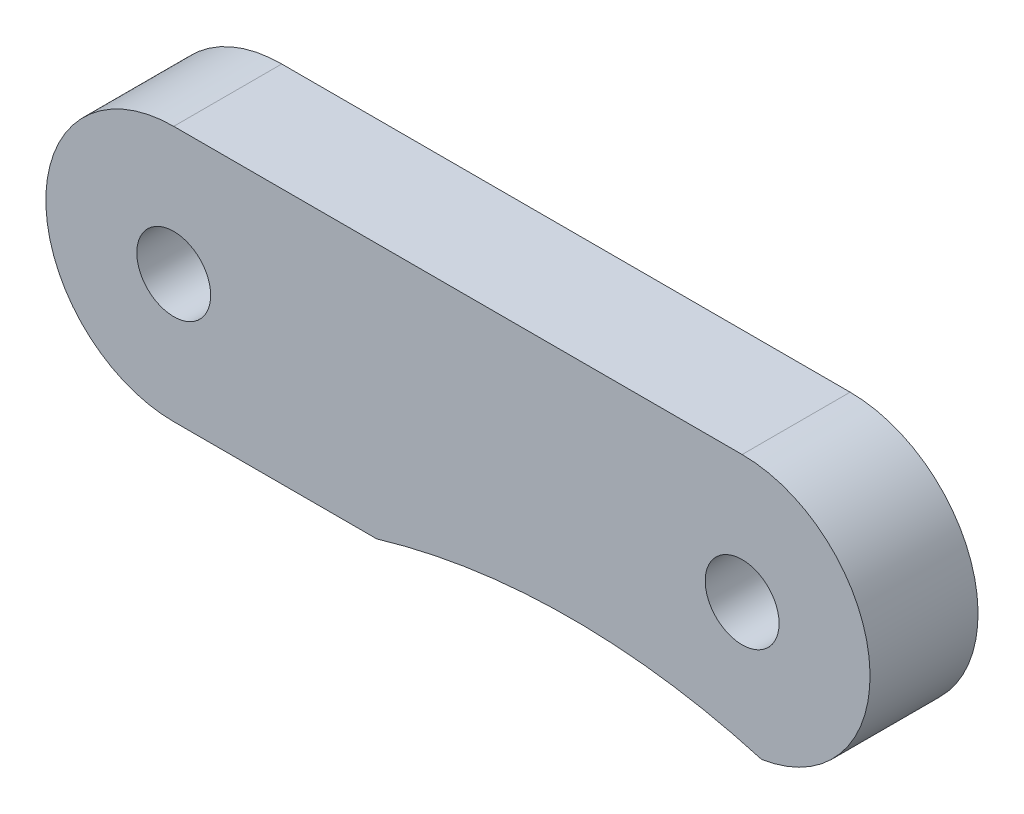
ISO-10303-21;
HEADER;
FILE_DESCRIPTION(('STEP AP214'),'2;1');
FILE_NAME('part.step','',(''),(''),'','','');
FILE_SCHEMA(('AUTOMOTIVE_DESIGN { 1 0 10303 214 1 1 1 1 }'));
ENDSEC;
DATA;
#1=APPLICATION_CONTEXT('core data for automotive mechanical design processes');
#2=APPLICATION_PROTOCOL_DEFINITION('international standard','automotive_design',2000,#1);
#3=PRODUCT_CONTEXT('',#1,'mechanical');
#4=PRODUCT('Part','Part','',(#3));
#5=PRODUCT_RELATED_PRODUCT_CATEGORY('part','',(#4));
#6=PRODUCT_DEFINITION_FORMATION('','',#4);
#7=PRODUCT_DEFINITION_CONTEXT('part definition',#1,'design');
#8=PRODUCT_DEFINITION('design','',#6,#7);
#9=PRODUCT_DEFINITION_SHAPE('','',#8);
#10=(LENGTH_UNIT() NAMED_UNIT(*) SI_UNIT(.MILLI.,.METRE.));
#11=(NAMED_UNIT(*) PLANE_ANGLE_UNIT() SI_UNIT($,.RADIAN.));
#12=(NAMED_UNIT(*) SI_UNIT($,.STERADIAN.) SOLID_ANGLE_UNIT());
#13=UNCERTAINTY_MEASURE_WITH_UNIT(LENGTH_MEASURE(1.E-05),#10,'distance_accuracy_value','');
#14=(GEOMETRIC_REPRESENTATION_CONTEXT(3) GLOBAL_UNCERTAINTY_ASSIGNED_CONTEXT((#13)) GLOBAL_UNIT_ASSIGNED_CONTEXT((#10,
#11,#12)) REPRESENTATION_CONTEXT('',''));
#15=CARTESIAN_POINT('',(0.,0.,0.));
#16=DIRECTION('',(0.,0.,1.));
#17=DIRECTION('',(1.,0.,0.));
#18=AXIS2_PLACEMENT_3D('',#15,#16,#17);
#19=CARTESIAN_POINT('',(-10.,0.,1.9));
#20=DIRECTION('',(0.,0.,-1.));
#21=DIRECTION('',(-1.,0.,0.));
#22=AXIS2_PLACEMENT_3D('',#19,#20,#21);
#23=PLANE('',#22);
#24=CARTESIAN_POINT('',(4.,-27.5,1.90000000000001));
#25=DIRECTION('',(0.,0.,1.));
#26=DIRECTION('',(1.,0.,0.));
#27=AXIS2_PLACEMENT_3D('',#24,#25,#26);
#28=CIRCLE('',#27,24.);
#29=CARTESIAN_POINT('',(-2.85565460040103,-4.5,1.90000000000001));
#30=VERTEX_POINT('',#29);
#31=CARTESIAN_POINT('',(10.6798972912214,-4.44834122717557,1.90000000000001));
#32=VERTEX_POINT('',#31);
#33=EDGE_CURVE('E19',#30,#32,#28,.F.);
#34=ORIENTED_EDGE('',*,*,#33,.T.);
#35=CARTESIAN_POINT('',(10.,0.,1.9));
#36=DIRECTION('',(0.,0.,1.));
#37=DIRECTION('',(1.,0.,0.));
#38=AXIS2_PLACEMENT_3D('',#35,#36,#37);
#39=CIRCLE('',#38,4.5);
#40=CARTESIAN_POINT('',(10.,4.5,1.9));
#41=VERTEX_POINT('',#40);
#42=EDGE_CURVE('E107',#41,#32,#39,.F.);
#43=ORIENTED_EDGE('',*,*,#42,.F.);
#44=DIRECTION('',(-1.,0.,0.));
#45=VECTOR('',#44,1.);
#46=CARTESIAN_POINT('',(-10.,4.5,1.9));
#47=LINE('',#46,#45);
#48=CARTESIAN_POINT('',(-10.,4.5,1.9));
#49=VERTEX_POINT('',#48);
#50=EDGE_CURVE('E87',#49,#41,#47,.F.);
#51=ORIENTED_EDGE('',*,*,#50,.F.);
#52=CARTESIAN_POINT('',(-10.,0.,1.9));
#53=DIRECTION('',(0.,0.,1.));
#54=DIRECTION('',(1.,0.,0.));
#55=AXIS2_PLACEMENT_3D('',#52,#53,#54);
#56=CIRCLE('',#55,4.5);
#57=CARTESIAN_POINT('',(-10.,-4.5,1.9));
#58=VERTEX_POINT('',#57);
#59=EDGE_CURVE('E74',#58,#49,#56,.F.);
#60=ORIENTED_EDGE('',*,*,#59,.F.);
#61=DIRECTION('',(1.,0.,0.));
#62=VECTOR('',#61,1.);
#63=CARTESIAN_POINT('',(-10.,-4.5,1.9));
#64=LINE('',#63,#62);
#65=EDGE_CURVE('E71',#30,#58,#64,.F.);
#66=ORIENTED_EDGE('',*,*,#65,.F.);
#67=EDGE_LOOP('',(#34,#43,#51,#60,#66));
#68=FACE_BOUND('',#67,.T.);
#69=CARTESIAN_POINT('',(-10.,0.,1.9));
#70=DIRECTION('',(0.,0.,1.));
#71=DIRECTION('',(1.,0.,0.));
#72=AXIS2_PLACEMENT_3D('',#69,#70,#71);
#73=CIRCLE('',#72,1.3);
#74=CARTESIAN_POINT('',(-8.7,0.,1.9));
#75=VERTEX_POINT('',#74);
#76=EDGE_CURVE('E101',#75,#75,#73,.F.);
#77=ORIENTED_EDGE('',*,*,#76,.T.);
#78=EDGE_LOOP('',(#77));
#79=FACE_BOUND('',#78,.T.);
#80=CARTESIAN_POINT('',(10.,0.,1.9));
#81=DIRECTION('',(0.,0.,1.));
#82=DIRECTION('',(1.,0.,0.));
#83=AXIS2_PLACEMENT_3D('',#80,#81,#82);
#84=CIRCLE('',#83,1.3);
#85=CARTESIAN_POINT('',(11.3,0.,1.9));
#86=VERTEX_POINT('',#85);
#87=EDGE_CURVE('E104',#86,#86,#84,.F.);
#88=ORIENTED_EDGE('',*,*,#87,.T.);
#89=EDGE_LOOP('',(#88));
#90=FACE_BOUND('',#89,.T.);
#91=ADVANCED_FACE('F16',(#68,#79,#90),#23,.F.);
#92=CARTESIAN_POINT('',(4.,-27.5,191.731582466187));
#93=DIRECTION('',(0.,0.,1.));
#94=DIRECTION('',(1.,0.,0.));
#95=AXIS2_PLACEMENT_3D('',#92,#93,#94);
#96=CYLINDRICAL_SURFACE('',#95,24.);
#97=CARTESIAN_POINT('',(4.,-27.5,-1.90000000000001));
#98=DIRECTION('',(0.,0.,1.));
#99=DIRECTION('',(1.,0.,0.));
#100=AXIS2_PLACEMENT_3D('',#97,#98,#99);
#101=CIRCLE('',#100,24.);
#102=CARTESIAN_POINT('',(10.6798972912214,-4.44834122717557,-1.90000000000001));
#103=VERTEX_POINT('',#102);
#104=CARTESIAN_POINT('',(-2.85565460040104,-4.5,-1.90000000000001));
#105=VERTEX_POINT('',#104);
#106=EDGE_CURVE('E99',#103,#105,#101,.T.);
#107=ORIENTED_EDGE('',*,*,#106,.F.);
#108=DIRECTION('',(0.,0.,1.));
#109=VECTOR('',#108,1.);
#110=CARTESIAN_POINT('',(10.6798972912214,-4.44834122717556,1.9));
#111=LINE('',#110,#109);
#112=EDGE_CURVE('E66',#32,#103,#111,.F.);
#113=ORIENTED_EDGE('',*,*,#112,.F.);
#114=ORIENTED_EDGE('',*,*,#33,.F.);
#115=DIRECTION('',(0.,0.,1.));
#116=VECTOR('',#115,1.);
#117=CARTESIAN_POINT('',(-2.85565460040103,-4.5,1.9));
#118=LINE('',#117,#116);
#119=EDGE_CURVE('E63',#105,#30,#118,.T.);
#120=ORIENTED_EDGE('',*,*,#119,.F.);
#121=EDGE_LOOP('',(#107,#113,#114,#120));
#122=FACE_BOUND('',#121,.T.);
#123=ADVANCED_FACE('F61',(#122),#96,.F.);
#124=CARTESIAN_POINT('',(-10.,-4.5,1.9));
#125=DIRECTION('',(0.,-1.,0.));
#126=DIRECTION('',(1.,0.,0.));
#127=AXIS2_PLACEMENT_3D('',#124,#125,#126);
#128=PLANE('',#127);
#129=DIRECTION('',(0.,0.,1.));
#130=VECTOR('',#129,1.);
#131=CARTESIAN_POINT('',(-10.,-4.5,1.9));
#132=LINE('',#131,#130);
#133=CARTESIAN_POINT('',(-10.,-4.5,-1.9));
#134=VERTEX_POINT('',#133);
#135=EDGE_CURVE('E77',#134,#58,#132,.T.);
#136=ORIENTED_EDGE('',*,*,#135,.F.);
#137=DIRECTION('',(-1.,0.,0.));
#138=VECTOR('',#137,1.);
#139=CARTESIAN_POINT('',(-10.,-4.5,-1.9));
#140=LINE('',#139,#138);
#141=EDGE_CURVE('E81',#105,#134,#140,.T.);
#142=ORIENTED_EDGE('',*,*,#141,.F.);
#143=ORIENTED_EDGE('',*,*,#119,.T.);
#144=ORIENTED_EDGE('',*,*,#65,.T.);
#145=EDGE_LOOP('',(#136,#142,#143,#144));
#146=FACE_BOUND('',#145,.T.);
#147=ADVANCED_FACE('F79',(#146),#128,.T.);
#148=CARTESIAN_POINT('',(-10.,0.,1.9));
#149=DIRECTION('',(0.,0.,1.));
#150=DIRECTION('',(1.,0.,0.));
#151=AXIS2_PLACEMENT_3D('',#148,#149,#150);
#152=CYLINDRICAL_SURFACE('',#151,4.5);
#153=ORIENTED_EDGE('',*,*,#59,.T.);
#154=DIRECTION('',(0.,0.,1.));
#155=VECTOR('',#154,1.);
#156=CARTESIAN_POINT('',(-10.,4.5,1.9));
#157=LINE('',#156,#155);
#158=CARTESIAN_POINT('',(-10.,4.5,-1.9));
#159=VERTEX_POINT('',#158);
#160=EDGE_CURVE('E88',#159,#49,#157,.T.);
#161=ORIENTED_EDGE('',*,*,#160,.F.);
#162=CARTESIAN_POINT('',(-10.,0.,-1.9));
#163=DIRECTION('',(0.,0.,1.));
#164=DIRECTION('',(1.,0.,0.));
#165=AXIS2_PLACEMENT_3D('',#162,#163,#164);
#166=CIRCLE('',#165,4.5);
#167=EDGE_CURVE('E96',#134,#159,#166,.F.);
#168=ORIENTED_EDGE('',*,*,#167,.F.);
#169=ORIENTED_EDGE('',*,*,#135,.T.);
#170=EDGE_LOOP('',(#153,#161,#168,#169));
#171=FACE_BOUND('',#170,.T.);
#172=ADVANCED_FACE('F111',(#171),#152,.T.);
#173=CARTESIAN_POINT('',(-10.,4.5,1.9));
#174=DIRECTION('',(0.,1.,0.));
#175=DIRECTION('',(-1.,0.,0.));
#176=AXIS2_PLACEMENT_3D('',#173,#174,#175);
#177=PLANE('',#176);
#178=ORIENTED_EDGE('',*,*,#50,.T.);
#179=DIRECTION('',(0.,0.,1.));
#180=VECTOR('',#179,1.);
#181=CARTESIAN_POINT('',(10.,4.5,1.9));
#182=LINE('',#181,#180);
#183=CARTESIAN_POINT('',(10.,4.5,-1.9));
#184=VERTEX_POINT('',#183);
#185=EDGE_CURVE('E34',#184,#41,#182,.T.);
#186=ORIENTED_EDGE('',*,*,#185,.F.);
#187=DIRECTION('',(-1.,0.,0.));
#188=VECTOR('',#187,1.);
#189=CARTESIAN_POINT('',(-10.,4.5,-1.9));
#190=LINE('',#189,#188);
#191=EDGE_CURVE('E95',#159,#184,#190,.F.);
#192=ORIENTED_EDGE('',*,*,#191,.F.);
#193=ORIENTED_EDGE('',*,*,#160,.T.);
#194=EDGE_LOOP('',(#178,#186,#192,#193));
#195=FACE_BOUND('',#194,.T.);
#196=ADVANCED_FACE('F121',(#195),#177,.T.);
#197=CARTESIAN_POINT('',(10.,0.,1.9));
#198=DIRECTION('',(0.,0.,1.));
#199=DIRECTION('',(1.,0.,0.));
#200=AXIS2_PLACEMENT_3D('',#197,#198,#199);
#201=CYLINDRICAL_SURFACE('',#200,4.5);
#202=ORIENTED_EDGE('',*,*,#185,.T.);
#203=ORIENTED_EDGE('',*,*,#42,.T.);
#204=ORIENTED_EDGE('',*,*,#112,.T.);
#205=CARTESIAN_POINT('',(10.,0.,-1.9));
#206=DIRECTION('',(0.,0.,1.));
#207=DIRECTION('',(1.,0.,0.));
#208=AXIS2_PLACEMENT_3D('',#205,#206,#207);
#209=CIRCLE('',#208,4.5);
#210=EDGE_CURVE('E92',#184,#103,#209,.F.);
#211=ORIENTED_EDGE('',*,*,#210,.F.);
#212=EDGE_LOOP('',(#202,#203,#204,#211));
#213=FACE_BOUND('',#212,.T.);
#214=ADVANCED_FACE('F120',(#213),#201,.T.);
#215=CARTESIAN_POINT('',(10.,0.,1.9));
#216=DIRECTION('',(0.,0.,1.));
#217=DIRECTION('',(1.,0.,0.));
#218=AXIS2_PLACEMENT_3D('',#215,#216,#217);
#219=CYLINDRICAL_SURFACE('',#218,1.3);
#220=CARTESIAN_POINT('',(10.,0.,-1.9));
#221=DIRECTION('',(0.,0.,1.));
#222=DIRECTION('',(1.,0.,0.));
#223=AXIS2_PLACEMENT_3D('',#220,#221,#222);
#224=CIRCLE('',#223,1.3);
#225=CARTESIAN_POINT('',(11.3,0.,-1.9));
#226=VERTEX_POINT('',#225);
#227=EDGE_CURVE('E25',#226,#226,#224,.T.);
#228=ORIENTED_EDGE('',*,*,#227,.F.);
#229=EDGE_LOOP('',(#228));
#230=FACE_BOUND('',#229,.T.);
#231=ORIENTED_EDGE('',*,*,#87,.F.);
#232=EDGE_LOOP('',(#231));
#233=FACE_BOUND('',#232,.T.);
#234=ADVANCED_FACE('F129',(#230,#233),#219,.F.);
#235=CARTESIAN_POINT('',(-10.,0.,1.9));
#236=DIRECTION('',(0.,0.,1.));
#237=DIRECTION('',(1.,0.,0.));
#238=AXIS2_PLACEMENT_3D('',#235,#236,#237);
#239=CYLINDRICAL_SURFACE('',#238,1.3);
#240=CARTESIAN_POINT('',(-10.,0.,-1.9));
#241=DIRECTION('',(0.,0.,1.));
#242=DIRECTION('',(1.,0.,0.));
#243=AXIS2_PLACEMENT_3D('',#240,#241,#242);
#244=CIRCLE('',#243,1.3);
#245=CARTESIAN_POINT('',(-8.7,0.,-1.9));
#246=VERTEX_POINT('',#245);
#247=EDGE_CURVE('E11',#246,#246,#244,.T.);
#248=ORIENTED_EDGE('',*,*,#247,.F.);
#249=EDGE_LOOP('',(#248));
#250=FACE_BOUND('',#249,.T.);
#251=ORIENTED_EDGE('',*,*,#76,.F.);
#252=EDGE_LOOP('',(#251));
#253=FACE_BOUND('',#252,.T.);
#254=ADVANCED_FACE('F133',(#250,#253),#239,.F.);
#255=CARTESIAN_POINT('',(-10.,0.,-1.9));
#256=DIRECTION('',(0.,0.,-1.));
#257=DIRECTION('',(-1.,0.,0.));
#258=AXIS2_PLACEMENT_3D('',#255,#256,#257);
#259=PLANE('',#258);
#260=ORIENTED_EDGE('',*,*,#247,.T.);
#261=EDGE_LOOP('',(#260));
#262=FACE_BOUND('',#261,.T.);
#263=ORIENTED_EDGE('',*,*,#227,.T.);
#264=EDGE_LOOP('',(#263));
#265=FACE_BOUND('',#264,.T.);
#266=ORIENTED_EDGE('',*,*,#191,.T.);
#267=ORIENTED_EDGE('',*,*,#210,.T.);
#268=ORIENTED_EDGE('',*,*,#106,.T.);
#269=ORIENTED_EDGE('',*,*,#141,.T.);
#270=ORIENTED_EDGE('',*,*,#167,.T.);
#271=EDGE_LOOP('',(#266,#267,#268,#269,#270));
#272=FACE_BOUND('',#271,.T.);
#273=ADVANCED_FACE('F114',(#262,#265,#272),#259,.T.);
#274=CLOSED_SHELL('',(#91,#123,#147,#172,#196,#214,#234,#254,#273));
#275=MANIFOLD_SOLID_BREP('B1',#274);
#276=ADVANCED_BREP_SHAPE_REPRESENTATION('',(#18,#275),#14);
#277=SHAPE_DEFINITION_REPRESENTATION(#9,#276);
ENDSEC;
END-ISO-10303-21;
